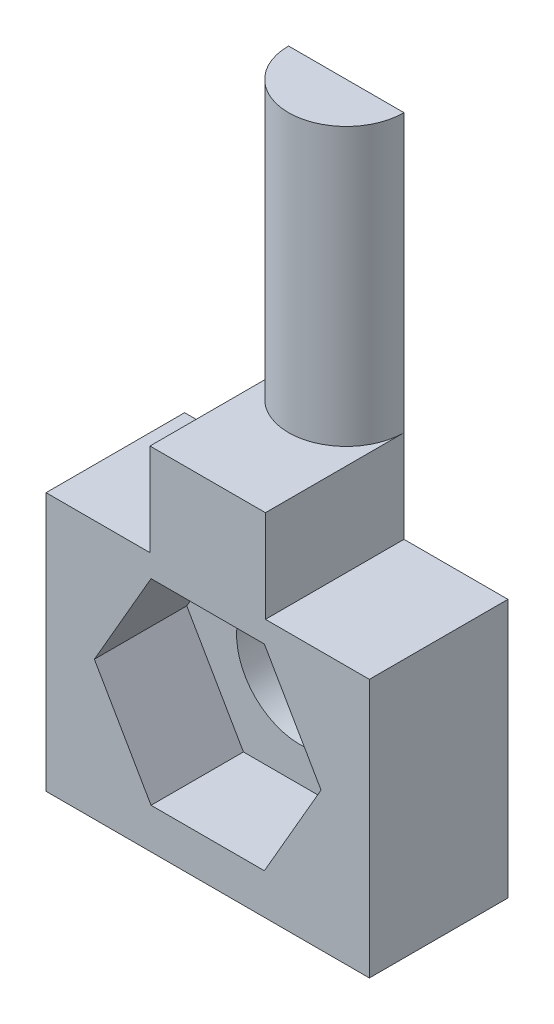
ISO-10303-21;
HEADER;
FILE_DESCRIPTION(('STEP AP214'),'2;1');
FILE_NAME('part.step','',(''),(''),'','','');
FILE_SCHEMA(('AUTOMOTIVE_DESIGN { 1 0 10303 214 1 1 1 1 }'));
ENDSEC;
DATA;
#1=APPLICATION_CONTEXT('core data for automotive mechanical design processes');
#2=APPLICATION_PROTOCOL_DEFINITION('international standard','automotive_design',2000,#1);
#3=PRODUCT_CONTEXT('',#1,'mechanical');
#4=PRODUCT('Part','Part','',(#3));
#5=PRODUCT_RELATED_PRODUCT_CATEGORY('part','',(#4));
#6=PRODUCT_DEFINITION_FORMATION('','',#4);
#7=PRODUCT_DEFINITION_CONTEXT('part definition',#1,'design');
#8=PRODUCT_DEFINITION('design','',#6,#7);
#9=PRODUCT_DEFINITION_SHAPE('','',#8);
#10=(LENGTH_UNIT() NAMED_UNIT(*) SI_UNIT(.MILLI.,.METRE.));
#11=(NAMED_UNIT(*) PLANE_ANGLE_UNIT() SI_UNIT($,.RADIAN.));
#12=(NAMED_UNIT(*) SI_UNIT($,.STERADIAN.) SOLID_ANGLE_UNIT());
#13=UNCERTAINTY_MEASURE_WITH_UNIT(LENGTH_MEASURE(1.E-05),#10,'distance_accuracy_value','');
#14=(GEOMETRIC_REPRESENTATION_CONTEXT(3) GLOBAL_UNCERTAINTY_ASSIGNED_CONTEXT((#13)) GLOBAL_UNIT_ASSIGNED_CONTEXT((#10,
#11,#12)) REPRESENTATION_CONTEXT('',''));
#15=CARTESIAN_POINT('',(0.,0.,0.));
#16=DIRECTION('',(0.,0.,1.));
#17=DIRECTION('',(1.,0.,0.));
#18=AXIS2_PLACEMENT_3D('',#15,#16,#17);
#19=CARTESIAN_POINT('',(-7.,6.,6.));
#20=DIRECTION('',(0.,0.,-1.));
#21=DIRECTION('',(-1.,0.,0.));
#22=AXIS2_PLACEMENT_3D('',#19,#20,#21);
#23=CYLINDRICAL_SURFACE('',#22,2.75);
#24=CARTESIAN_POINT('',(-7.,6.,0.));
#25=DIRECTION('',(0.,0.,1.));
#26=DIRECTION('',(1.,0.,0.));
#27=AXIS2_PLACEMENT_3D('',#24,#25,#26);
#28=CIRCLE('',#27,2.75);
#29=CARTESIAN_POINT('',(-4.25,6.,0.));
#30=VERTEX_POINT('',#29);
#31=EDGE_CURVE('E144',#30,#30,#28,.T.);
#32=ORIENTED_EDGE('',*,*,#31,.F.);
#33=EDGE_LOOP('',(#32));
#34=FACE_BOUND('',#33,.T.);
#35=CARTESIAN_POINT('',(-7.,6.,2.));
#36=DIRECTION('',(0.,0.,1.));
#37=DIRECTION('',(1.,0.,0.));
#38=AXIS2_PLACEMENT_3D('',#35,#36,#37);
#39=CIRCLE('',#38,2.75);
#40=CARTESIAN_POINT('',(-4.25,6.,2.));
#41=VERTEX_POINT('',#40);
#42=EDGE_CURVE('E37',#41,#41,#39,.T.);
#43=ORIENTED_EDGE('',*,*,#42,.T.);
#44=EDGE_LOOP('',(#43));
#45=FACE_BOUND('',#44,.T.);
#46=ADVANCED_FACE('F33',(#34,#45),#23,.F.);
#47=CARTESIAN_POINT('',(0.,0.,6.));
#48=DIRECTION('',(0.,0.,1.));
#49=DIRECTION('',(1.,0.,0.));
#50=AXIS2_PLACEMENT_3D('',#47,#48,#49);
#51=PLANE('',#50);
#52=DIRECTION('',(0.5,0.866025403784438,0.));
#53=VECTOR('',#52,1.);
#54=CARTESIAN_POINT('',(-4.54626135594409,1.75,6.));
#55=LINE('',#54,#53);
#56=CARTESIAN_POINT('',(-4.54626135594409,1.75,6.));
#57=VERTEX_POINT('',#56);
#58=CARTESIAN_POINT('',(-2.09252271188818,6.,6.));
#59=VERTEX_POINT('',#58);
#60=EDGE_CURVE('E49',#57,#59,#55,.T.);
#61=ORIENTED_EDGE('',*,*,#60,.F.);
#62=DIRECTION('',(1.,0.,0.));
#63=VECTOR('',#62,1.);
#64=CARTESIAN_POINT('',(-9.45373864405591,1.75,6.));
#65=LINE('',#64,#63);
#66=CARTESIAN_POINT('',(-9.45373864405591,1.75,6.));
#67=VERTEX_POINT('',#66);
#68=EDGE_CURVE('E417',#67,#57,#65,.T.);
#69=ORIENTED_EDGE('',*,*,#68,.F.);
#70=DIRECTION('',(0.5,-0.866025403784439,0.));
#71=VECTOR('',#70,1.);
#72=CARTESIAN_POINT('',(-11.9074772881118,6.,6.));
#73=LINE('',#72,#71);
#74=CARTESIAN_POINT('',(-11.9074772881118,6.,6.));
#75=VERTEX_POINT('',#74);
#76=EDGE_CURVE('E422',#75,#67,#73,.T.);
#77=ORIENTED_EDGE('',*,*,#76,.F.);
#78=DIRECTION('',(-0.5,-0.866025403784439,0.));
#79=VECTOR('',#78,1.);
#80=CARTESIAN_POINT('',(-9.45373864405591,10.25,6.));
#81=LINE('',#80,#79);
#82=CARTESIAN_POINT('',(-9.45373864405591,10.25,6.));
#83=VERTEX_POINT('',#82);
#84=EDGE_CURVE('E440',#83,#75,#81,.T.);
#85=ORIENTED_EDGE('',*,*,#84,.F.);
#86=DIRECTION('',(-1.,0.,0.));
#87=VECTOR('',#86,1.);
#88=CARTESIAN_POINT('',(-4.54626135594409,10.25,6.));
#89=LINE('',#88,#87);
#90=CARTESIAN_POINT('',(-4.54626135594409,10.25,6.));
#91=VERTEX_POINT('',#90);
#92=EDGE_CURVE('E437',#91,#83,#89,.T.);
#93=ORIENTED_EDGE('',*,*,#92,.F.);
#94=DIRECTION('',(-0.5,0.866025403784439,0.));
#95=VECTOR('',#94,1.);
#96=CARTESIAN_POINT('',(-2.09252271188818,6.,6.));
#97=LINE('',#96,#95);
#98=EDGE_CURVE('E434',#59,#91,#97,.T.);
#99=ORIENTED_EDGE('',*,*,#98,.F.);
#100=EDGE_LOOP('',(#61,#69,#77,#85,#93,#99));
#101=FACE_BOUND('',#100,.T.);
#102=DIRECTION('',(0.,1.,0.));
#103=VECTOR('',#102,1.);
#104=CARTESIAN_POINT('',(0.,0.,6.));
#105=LINE('',#104,#103);
#106=CARTESIAN_POINT('',(0.,0.,6.));
#107=VERTEX_POINT('',#106);
#108=CARTESIAN_POINT('',(0.,11.2,6.));
#109=VERTEX_POINT('',#108);
#110=EDGE_CURVE('E155',#107,#109,#105,.T.);
#111=ORIENTED_EDGE('',*,*,#110,.T.);
#112=DIRECTION('',(-1.,0.,0.));
#113=VECTOR('',#112,1.);
#114=CARTESIAN_POINT('',(0.,11.2,6.));
#115=LINE('',#114,#113);
#116=CARTESIAN_POINT('',(-4.5,11.2,6.));
#117=VERTEX_POINT('',#116);
#118=EDGE_CURVE('E96',#109,#117,#115,.T.);
#119=ORIENTED_EDGE('',*,*,#118,.T.);
#120=DIRECTION('',(0.,1.,0.));
#121=VECTOR('',#120,1.);
#122=CARTESIAN_POINT('',(-4.5,11.2,6.));
#123=LINE('',#122,#121);
#124=CARTESIAN_POINT('',(-4.5,15.2,6.));
#125=VERTEX_POINT('',#124);
#126=EDGE_CURVE('E172',#117,#125,#123,.T.);
#127=ORIENTED_EDGE('',*,*,#126,.T.);
#128=DIRECTION('',(-1.,0.,0.));
#129=VECTOR('',#128,1.);
#130=CARTESIAN_POINT('',(-9.5,15.2,6.));
#131=LINE('',#130,#129);
#132=CARTESIAN_POINT('',(-9.5,15.2,6.));
#133=VERTEX_POINT('',#132);
#134=EDGE_CURVE('E209',#125,#133,#131,.T.);
#135=ORIENTED_EDGE('',*,*,#134,.T.);
#136=DIRECTION('',(0.,-1.,0.));
#137=VECTOR('',#136,1.);
#138=CARTESIAN_POINT('',(-9.5,11.2,6.));
#139=LINE('',#138,#137);
#140=CARTESIAN_POINT('',(-9.5,11.2,6.));
#141=VERTEX_POINT('',#140);
#142=EDGE_CURVE('E119',#133,#141,#139,.T.);
#143=ORIENTED_EDGE('',*,*,#142,.T.);
#144=DIRECTION('',(-1.,0.,0.));
#145=VECTOR('',#144,1.);
#146=CARTESIAN_POINT('',(-9.5,11.2,6.));
#147=LINE('',#146,#145);
#148=CARTESIAN_POINT('',(-14.,11.2,6.));
#149=VERTEX_POINT('',#148);
#150=EDGE_CURVE('E112',#141,#149,#147,.T.);
#151=ORIENTED_EDGE('',*,*,#150,.T.);
#152=DIRECTION('',(0.,-1.,0.));
#153=VECTOR('',#152,1.);
#154=CARTESIAN_POINT('',(-14.,0.,6.));
#155=LINE('',#154,#153);
#156=CARTESIAN_POINT('',(-14.,0.,6.));
#157=VERTEX_POINT('',#156);
#158=EDGE_CURVE('E116',#149,#157,#155,.T.);
#159=ORIENTED_EDGE('',*,*,#158,.T.);
#160=DIRECTION('',(1.,0.,0.));
#161=VECTOR('',#160,1.);
#162=CARTESIAN_POINT('',(0.,0.,6.));
#163=LINE('',#162,#161);
#164=EDGE_CURVE('E58',#157,#107,#163,.T.);
#165=ORIENTED_EDGE('',*,*,#164,.T.);
#166=EDGE_LOOP('',(#111,#119,#127,#135,#143,#151,#159,#165));
#167=FACE_BOUND('',#166,.T.);
#168=ADVANCED_FACE('F114',(#101,#167),#51,.T.);
#169=CARTESIAN_POINT('',(0.,0.,0.));
#170=DIRECTION('',(0.,0.,1.));
#171=DIRECTION('',(1.,0.,0.));
#172=AXIS2_PLACEMENT_3D('',#169,#170,#171);
#173=PLANE('',#172);
#174=DIRECTION('',(0.,1.,0.));
#175=VECTOR('',#174,1.);
#176=CARTESIAN_POINT('',(0.,0.,0.));
#177=LINE('',#176,#175);
#178=CARTESIAN_POINT('',(0.,0.,0.));
#179=VERTEX_POINT('',#178);
#180=CARTESIAN_POINT('',(0.,11.2,0.));
#181=VERTEX_POINT('',#180);
#182=EDGE_CURVE('E140',#179,#181,#177,.T.);
#183=ORIENTED_EDGE('',*,*,#182,.F.);
#184=DIRECTION('',(1.,0.,0.));
#185=VECTOR('',#184,1.);
#186=CARTESIAN_POINT('',(0.,0.,0.));
#187=LINE('',#186,#185);
#188=CARTESIAN_POINT('',(-14.,0.,0.));
#189=VERTEX_POINT('',#188);
#190=EDGE_CURVE('E88',#189,#179,#187,.T.);
#191=ORIENTED_EDGE('',*,*,#190,.F.);
#192=DIRECTION('',(0.,-1.,0.));
#193=VECTOR('',#192,1.);
#194=CARTESIAN_POINT('',(-14.,0.,0.));
#195=LINE('',#194,#193);
#196=CARTESIAN_POINT('',(-14.,11.2,0.));
#197=VERTEX_POINT('',#196);
#198=EDGE_CURVE('E152',#197,#189,#195,.T.);
#199=ORIENTED_EDGE('',*,*,#198,.F.);
#200=DIRECTION('',(-1.,0.,0.));
#201=VECTOR('',#200,1.);
#202=CARTESIAN_POINT('',(-9.5,11.2,0.));
#203=LINE('',#202,#201);
#204=CARTESIAN_POINT('',(-9.5,11.2,0.));
#205=VERTEX_POINT('',#204);
#206=EDGE_CURVE('E128',#205,#197,#203,.T.);
#207=ORIENTED_EDGE('',*,*,#206,.F.);
#208=DIRECTION('',(0.,-1.,0.));
#209=VECTOR('',#208,1.);
#210=CARTESIAN_POINT('',(-9.5,11.2,0.));
#211=LINE('',#210,#209);
#212=CARTESIAN_POINT('',(-9.5,15.2,0.));
#213=VERTEX_POINT('',#212);
#214=EDGE_CURVE('E149',#213,#205,#211,.T.);
#215=ORIENTED_EDGE('',*,*,#214,.F.);
#216=DIRECTION('',(0.,-1.,0.));
#217=VECTOR('',#216,1.);
#218=CARTESIAN_POINT('',(-9.5,27.2,0.));
#219=LINE('',#218,#217);
#220=CARTESIAN_POINT('',(-9.5,27.2,0.));
#221=VERTEX_POINT('',#220);
#222=EDGE_CURVE('E189',#221,#213,#219,.T.);
#223=ORIENTED_EDGE('',*,*,#222,.F.);
#224=DIRECTION('',(-1.,0.,0.));
#225=VECTOR('',#224,1.);
#226=CARTESIAN_POINT('',(-9.5,27.2,0.));
#227=LINE('',#226,#225);
#228=CARTESIAN_POINT('',(-4.5,27.2,0.));
#229=VERTEX_POINT('',#228);
#230=EDGE_CURVE('E184',#229,#221,#227,.T.);
#231=ORIENTED_EDGE('',*,*,#230,.F.);
#232=DIRECTION('',(0.,-1.,0.));
#233=VECTOR('',#232,1.);
#234=CARTESIAN_POINT('',(-4.5,27.2,0.));
#235=LINE('',#234,#233);
#236=CARTESIAN_POINT('',(-4.5,15.2,0.));
#237=VERTEX_POINT('',#236);
#238=EDGE_CURVE('E179',#229,#237,#235,.T.);
#239=ORIENTED_EDGE('',*,*,#238,.T.);
#240=DIRECTION('',(0.,1.,0.));
#241=VECTOR('',#240,1.);
#242=CARTESIAN_POINT('',(-4.5,11.2,0.));
#243=LINE('',#242,#241);
#244=CARTESIAN_POINT('',(-4.5,11.2,0.));
#245=VERTEX_POINT('',#244);
#246=EDGE_CURVE('E146',#245,#237,#243,.T.);
#247=ORIENTED_EDGE('',*,*,#246,.F.);
#248=DIRECTION('',(-1.,0.,0.));
#249=VECTOR('',#248,1.);
#250=CARTESIAN_POINT('',(0.,11.2,0.));
#251=LINE('',#250,#249);
#252=EDGE_CURVE('E143',#181,#245,#251,.T.);
#253=ORIENTED_EDGE('',*,*,#252,.F.);
#254=EDGE_LOOP('',(#183,#191,#199,#207,#215,#223,#231,#239,#247,#253));
#255=FACE_BOUND('',#254,.T.);
#256=ORIENTED_EDGE('',*,*,#31,.T.);
#257=EDGE_LOOP('',(#256));
#258=FACE_BOUND('',#257,.T.);
#259=ADVANCED_FACE('F175',(#255,#258),#173,.F.);
#260=CARTESIAN_POINT('',(0.,0.,6.));
#261=DIRECTION('',(-1.,0.,0.));
#262=DIRECTION('',(0.,-1.,0.));
#263=AXIS2_PLACEMENT_3D('',#260,#261,#262);
#264=PLANE('',#263);
#265=ORIENTED_EDGE('',*,*,#182,.T.);
#266=DIRECTION('',(0.,0.,-1.));
#267=VECTOR('',#266,1.);
#268=CARTESIAN_POINT('',(0.,11.2,6.));
#269=LINE('',#268,#267);
#270=EDGE_CURVE('E11',#109,#181,#269,.T.);
#271=ORIENTED_EDGE('',*,*,#270,.F.);
#272=ORIENTED_EDGE('',*,*,#110,.F.);
#273=DIRECTION('',(0.,0.,-1.));
#274=VECTOR('',#273,1.);
#275=CARTESIAN_POINT('',(0.,0.,6.));
#276=LINE('',#275,#274);
#277=EDGE_CURVE('E136',#107,#179,#276,.T.);
#278=ORIENTED_EDGE('',*,*,#277,.T.);
#279=EDGE_LOOP('',(#265,#271,#272,#278));
#280=FACE_BOUND('',#279,.T.);
#281=ADVANCED_FACE('F35',(#280),#264,.F.);
#282=CARTESIAN_POINT('',(0.,11.2,6.));
#283=DIRECTION('',(0.,-1.,0.));
#284=DIRECTION('',(1.,0.,0.));
#285=AXIS2_PLACEMENT_3D('',#282,#283,#284);
#286=PLANE('',#285);
#287=ORIENTED_EDGE('',*,*,#252,.T.);
#288=DIRECTION('',(0.,0.,-1.));
#289=VECTOR('',#288,1.);
#290=CARTESIAN_POINT('',(-4.5,11.2,6.));
#291=LINE('',#290,#289);
#292=EDGE_CURVE('E42',#117,#245,#291,.T.);
#293=ORIENTED_EDGE('',*,*,#292,.F.);
#294=ORIENTED_EDGE('',*,*,#118,.F.);
#295=ORIENTED_EDGE('',*,*,#270,.T.);
#296=EDGE_LOOP('',(#287,#293,#294,#295));
#297=FACE_BOUND('',#296,.T.);
#298=ADVANCED_FACE('F219',(#297),#286,.F.);
#299=CARTESIAN_POINT('',(-4.5,11.2,6.));
#300=DIRECTION('',(-1.,0.,0.));
#301=DIRECTION('',(0.,0.,1.));
#302=AXIS2_PLACEMENT_3D('',#299,#300,#301);
#303=PLANE('',#302);
#304=ORIENTED_EDGE('',*,*,#246,.T.);
#305=DIRECTION('',(0.,0.,-1.));
#306=VECTOR('',#305,1.);
#307=CARTESIAN_POINT('',(-4.5,15.2,6.));
#308=LINE('',#307,#306);
#309=EDGE_CURVE('E162',#125,#237,#308,.T.);
#310=ORIENTED_EDGE('',*,*,#309,.F.);
#311=ORIENTED_EDGE('',*,*,#126,.F.);
#312=ORIENTED_EDGE('',*,*,#292,.T.);
#313=EDGE_LOOP('',(#304,#310,#311,#312));
#314=FACE_BOUND('',#313,.T.);
#315=ADVANCED_FACE('F169',(#314),#303,.F.);
#316=CARTESIAN_POINT('',(-9.5,15.2,6.));
#317=DIRECTION('',(0.,-1.,0.));
#318=DIRECTION('',(0.,0.,-1.));
#319=AXIS2_PLACEMENT_3D('',#316,#317,#318);
#320=PLANE('',#319);
#321=CARTESIAN_POINT('',(-7.,15.2,0.));
#322=DIRECTION('',(0.,1.,0.));
#323=DIRECTION('',(0.,0.,1.));
#324=AXIS2_PLACEMENT_3D('',#321,#322,#323);
#325=CIRCLE('',#324,2.5);
#326=EDGE_CURVE('E192',#213,#237,#325,.T.);
#327=ORIENTED_EDGE('',*,*,#326,.F.);
#328=DIRECTION('',(0.,0.,-1.));
#329=VECTOR('',#328,1.);
#330=CARTESIAN_POINT('',(-9.5,15.2,6.));
#331=LINE('',#330,#329);
#332=EDGE_CURVE('E159',#133,#213,#331,.T.);
#333=ORIENTED_EDGE('',*,*,#332,.F.);
#334=ORIENTED_EDGE('',*,*,#134,.F.);
#335=ORIENTED_EDGE('',*,*,#309,.T.);
#336=EDGE_LOOP('',(#327,#333,#334,#335));
#337=FACE_BOUND('',#336,.T.);
#338=ADVANCED_FACE('F211',(#337),#320,.F.);
#339=CARTESIAN_POINT('',(-9.5,11.2,6.));
#340=DIRECTION('',(1.,0.,0.));
#341=DIRECTION('',(0.,0.,-1.));
#342=AXIS2_PLACEMENT_3D('',#339,#340,#341);
#343=PLANE('',#342);
#344=ORIENTED_EDGE('',*,*,#214,.T.);
#345=DIRECTION('',(0.,0.,-1.));
#346=VECTOR('',#345,1.);
#347=CARTESIAN_POINT('',(-9.5,11.2,6.));
#348=LINE('',#347,#346);
#349=EDGE_CURVE('E131',#141,#205,#348,.T.);
#350=ORIENTED_EDGE('',*,*,#349,.F.);
#351=ORIENTED_EDGE('',*,*,#142,.F.);
#352=ORIENTED_EDGE('',*,*,#332,.T.);
#353=EDGE_LOOP('',(#344,#350,#351,#352));
#354=FACE_BOUND('',#353,.T.);
#355=ADVANCED_FACE('F214',(#354),#343,.F.);
#356=CARTESIAN_POINT('',(-9.5,11.2,6.));
#357=DIRECTION('',(0.,-1.,0.));
#358=DIRECTION('',(0.,0.,-1.));
#359=AXIS2_PLACEMENT_3D('',#356,#357,#358);
#360=PLANE('',#359);
#361=ORIENTED_EDGE('',*,*,#206,.T.);
#362=DIRECTION('',(0.,0.,-1.));
#363=VECTOR('',#362,1.);
#364=CARTESIAN_POINT('',(-14.,11.2,6.));
#365=LINE('',#364,#363);
#366=EDGE_CURVE('E125',#149,#197,#365,.T.);
#367=ORIENTED_EDGE('',*,*,#366,.F.);
#368=ORIENTED_EDGE('',*,*,#150,.F.);
#369=ORIENTED_EDGE('',*,*,#349,.T.);
#370=EDGE_LOOP('',(#361,#367,#368,#369));
#371=FACE_BOUND('',#370,.T.);
#372=ADVANCED_FACE('F126',(#371),#360,.F.);
#373=CARTESIAN_POINT('',(-14.,0.,6.));
#374=DIRECTION('',(1.,0.,0.));
#375=DIRECTION('',(0.,0.,-1.));
#376=AXIS2_PLACEMENT_3D('',#373,#374,#375);
#377=PLANE('',#376);
#378=ORIENTED_EDGE('',*,*,#198,.T.);
#379=DIRECTION('',(0.,0.,-1.));
#380=VECTOR('',#379,1.);
#381=CARTESIAN_POINT('',(-14.,0.,6.));
#382=LINE('',#381,#380);
#383=EDGE_CURVE('E132',#157,#189,#382,.T.);
#384=ORIENTED_EDGE('',*,*,#383,.F.);
#385=ORIENTED_EDGE('',*,*,#158,.F.);
#386=ORIENTED_EDGE('',*,*,#366,.T.);
#387=EDGE_LOOP('',(#378,#384,#385,#386));
#388=FACE_BOUND('',#387,.T.);
#389=ADVANCED_FACE('F134',(#388),#377,.F.);
#390=CARTESIAN_POINT('',(0.,0.,6.));
#391=DIRECTION('',(0.,1.,0.));
#392=DIRECTION('',(0.,0.,1.));
#393=AXIS2_PLACEMENT_3D('',#390,#391,#392);
#394=PLANE('',#393);
#395=ORIENTED_EDGE('',*,*,#190,.T.);
#396=ORIENTED_EDGE('',*,*,#277,.F.);
#397=ORIENTED_EDGE('',*,*,#164,.F.);
#398=ORIENTED_EDGE('',*,*,#383,.T.);
#399=EDGE_LOOP('',(#395,#396,#397,#398));
#400=FACE_BOUND('',#399,.T.);
#401=ADVANCED_FACE('F215',(#400),#394,.F.);
#402=CARTESIAN_POINT('',(-7.,27.2,0.));
#403=DIRECTION('',(0.,-1.,0.));
#404=DIRECTION('',(0.,0.,-1.));
#405=AXIS2_PLACEMENT_3D('',#402,#403,#404);
#406=CYLINDRICAL_SURFACE('',#405,2.5);
#407=ORIENTED_EDGE('',*,*,#326,.T.);
#408=ORIENTED_EDGE('',*,*,#238,.F.);
#409=CARTESIAN_POINT('',(-7.,27.2,0.));
#410=DIRECTION('',(0.,1.,0.));
#411=DIRECTION('',(0.,0.,1.));
#412=AXIS2_PLACEMENT_3D('',#409,#410,#411);
#413=CIRCLE('',#412,2.5);
#414=EDGE_CURVE('E196',#221,#229,#413,.T.);
#415=ORIENTED_EDGE('',*,*,#414,.F.);
#416=ORIENTED_EDGE('',*,*,#222,.T.);
#417=EDGE_LOOP('',(#407,#408,#415,#416));
#418=FACE_BOUND('',#417,.T.);
#419=ADVANCED_FACE('F193',(#418),#406,.T.);
#420=CARTESIAN_POINT('',(-7.,27.2,0.));
#421=DIRECTION('',(0.,1.,0.));
#422=DIRECTION('',(0.,0.,1.));
#423=AXIS2_PLACEMENT_3D('',#420,#421,#422);
#424=PLANE('',#423);
#425=ORIENTED_EDGE('',*,*,#414,.T.);
#426=ORIENTED_EDGE('',*,*,#230,.T.);
#427=EDGE_LOOP('',(#425,#426));
#428=FACE_BOUND('',#427,.T.);
#429=ADVANCED_FACE('F277',(#428),#424,.T.);
#430=CARTESIAN_POINT('',(-4.54626135594409,1.75,2.));
#431=DIRECTION('',(0.866025403784439,-0.5,0.));
#432=DIRECTION('',(0.5,0.866025403784439,0.));
#433=AXIS2_PLACEMENT_3D('',#430,#431,#432);
#434=PLANE('',#433);
#435=ORIENTED_EDGE('',*,*,#60,.T.);
#436=DIRECTION('',(0.,0.,1.));
#437=VECTOR('',#436,1.);
#438=CARTESIAN_POINT('',(-2.09252271188818,6.,2.));
#439=LINE('',#438,#437);
#440=CARTESIAN_POINT('',(-2.09252271188818,6.,2.));
#441=VERTEX_POINT('',#440);
#442=EDGE_CURVE('E432',#441,#59,#439,.T.);
#443=ORIENTED_EDGE('',*,*,#442,.F.);
#444=DIRECTION('',(0.5,0.866025403784438,0.));
#445=VECTOR('',#444,1.);
#446=CARTESIAN_POINT('',(-4.54626135594409,1.75,2.));
#447=LINE('',#446,#445);
#448=CARTESIAN_POINT('',(-4.54626135594409,1.75,2.));
#449=VERTEX_POINT('',#448);
#450=EDGE_CURVE('E407',#449,#441,#447,.T.);
#451=ORIENTED_EDGE('',*,*,#450,.F.);
#452=DIRECTION('',(0.,0.,1.));
#453=VECTOR('',#452,1.);
#454=CARTESIAN_POINT('',(-4.54626135594409,1.75,2.));
#455=LINE('',#454,#453);
#456=EDGE_CURVE('E200',#449,#57,#455,.T.);
#457=ORIENTED_EDGE('',*,*,#456,.T.);
#458=EDGE_LOOP('',(#435,#443,#451,#457));
#459=FACE_BOUND('',#458,.T.);
#460=ADVANCED_FACE('F283',(#459),#434,.F.);
#461=CARTESIAN_POINT('',(-9.45373864405591,1.75,2.));
#462=DIRECTION('',(0.,-1.,0.));
#463=DIRECTION('',(1.,0.,0.));
#464=AXIS2_PLACEMENT_3D('',#461,#462,#463);
#465=PLANE('',#464);
#466=ORIENTED_EDGE('',*,*,#68,.T.);
#467=ORIENTED_EDGE('',*,*,#456,.F.);
#468=DIRECTION('',(1.,0.,0.));
#469=VECTOR('',#468,1.);
#470=CARTESIAN_POINT('',(-9.45373864405591,1.75,2.));
#471=LINE('',#470,#469);
#472=CARTESIAN_POINT('',(-9.45373864405591,1.75,2.));
#473=VERTEX_POINT('',#472);
#474=EDGE_CURVE('E414',#473,#449,#471,.T.);
#475=ORIENTED_EDGE('',*,*,#474,.F.);
#476=DIRECTION('',(0.,0.,1.));
#477=VECTOR('',#476,1.);
#478=CARTESIAN_POINT('',(-9.45373864405591,1.75,2.));
#479=LINE('',#478,#477);
#480=EDGE_CURVE('E446',#473,#67,#479,.T.);
#481=ORIENTED_EDGE('',*,*,#480,.T.);
#482=EDGE_LOOP('',(#466,#467,#475,#481));
#483=FACE_BOUND('',#482,.T.);
#484=ADVANCED_FACE('F290',(#483),#465,.F.);
#485=CARTESIAN_POINT('',(-11.9074772881118,6.,2.));
#486=DIRECTION('',(-0.866025403784439,-0.5,0.));
#487=DIRECTION('',(0.5,-0.866025403784439,0.));
#488=AXIS2_PLACEMENT_3D('',#485,#486,#487);
#489=PLANE('',#488);
#490=ORIENTED_EDGE('',*,*,#76,.T.);
#491=ORIENTED_EDGE('',*,*,#480,.F.);
#492=DIRECTION('',(0.5,-0.866025403784439,0.));
#493=VECTOR('',#492,1.);
#494=CARTESIAN_POINT('',(-11.9074772881118,6.,2.));
#495=LINE('',#494,#493);
#496=CARTESIAN_POINT('',(-11.9074772881118,6.,2.));
#497=VERTEX_POINT('',#496);
#498=EDGE_CURVE('E429',#497,#473,#495,.T.);
#499=ORIENTED_EDGE('',*,*,#498,.F.);
#500=DIRECTION('',(0.,0.,1.));
#501=VECTOR('',#500,1.);
#502=CARTESIAN_POINT('',(-11.9074772881118,6.,2.));
#503=LINE('',#502,#501);
#504=EDGE_CURVE('E449',#497,#75,#503,.T.);
#505=ORIENTED_EDGE('',*,*,#504,.T.);
#506=EDGE_LOOP('',(#490,#491,#499,#505));
#507=FACE_BOUND('',#506,.T.);
#508=ADVANCED_FACE('F298',(#507),#489,.F.);
#509=CARTESIAN_POINT('',(-9.45373864405591,10.25,2.));
#510=DIRECTION('',(-0.866025403784439,0.5,0.));
#511=DIRECTION('',(-0.5,-0.866025403784439,0.));
#512=AXIS2_PLACEMENT_3D('',#509,#510,#511);
#513=PLANE('',#512);
#514=ORIENTED_EDGE('',*,*,#84,.T.);
#515=ORIENTED_EDGE('',*,*,#504,.F.);
#516=DIRECTION('',(-0.5,-0.866025403784439,0.));
#517=VECTOR('',#516,1.);
#518=CARTESIAN_POINT('',(-9.45373864405591,10.25,2.));
#519=LINE('',#518,#517);
#520=CARTESIAN_POINT('',(-9.45373864405591,10.25,2.));
#521=VERTEX_POINT('',#520);
#522=EDGE_CURVE('E426',#521,#497,#519,.T.);
#523=ORIENTED_EDGE('',*,*,#522,.F.);
#524=DIRECTION('',(0.,0.,1.));
#525=VECTOR('',#524,1.);
#526=CARTESIAN_POINT('',(-9.45373864405591,10.25,2.));
#527=LINE('',#526,#525);
#528=EDGE_CURVE('E452',#521,#83,#527,.T.);
#529=ORIENTED_EDGE('',*,*,#528,.T.);
#530=EDGE_LOOP('',(#514,#515,#523,#529));
#531=FACE_BOUND('',#530,.T.);
#532=ADVANCED_FACE('F306',(#531),#513,.F.);
#533=CARTESIAN_POINT('',(-4.54626135594409,10.25,2.));
#534=DIRECTION('',(0.,1.,0.));
#535=DIRECTION('',(0.,0.,1.));
#536=AXIS2_PLACEMENT_3D('',#533,#534,#535);
#537=PLANE('',#536);
#538=ORIENTED_EDGE('',*,*,#92,.T.);
#539=ORIENTED_EDGE('',*,*,#528,.F.);
#540=DIRECTION('',(-1.,0.,0.));
#541=VECTOR('',#540,1.);
#542=CARTESIAN_POINT('',(-4.54626135594409,10.25,2.));
#543=LINE('',#542,#541);
#544=CARTESIAN_POINT('',(-4.54626135594409,10.25,2.));
#545=VERTEX_POINT('',#544);
#546=EDGE_CURVE('E419',#545,#521,#543,.T.);
#547=ORIENTED_EDGE('',*,*,#546,.F.);
#548=DIRECTION('',(0.,0.,1.));
#549=VECTOR('',#548,1.);
#550=CARTESIAN_POINT('',(-4.54626135594409,10.25,2.));
#551=LINE('',#550,#549);
#552=EDGE_CURVE('E455',#545,#91,#551,.T.);
#553=ORIENTED_EDGE('',*,*,#552,.T.);
#554=EDGE_LOOP('',(#538,#539,#547,#553));
#555=FACE_BOUND('',#554,.T.);
#556=ADVANCED_FACE('F314',(#555),#537,.F.);
#557=CARTESIAN_POINT('',(-2.09252271188818,6.,2.));
#558=DIRECTION('',(0.866025403784439,0.5,0.));
#559=DIRECTION('',(-0.5,0.866025403784439,0.));
#560=AXIS2_PLACEMENT_3D('',#557,#558,#559);
#561=PLANE('',#560);
#562=ORIENTED_EDGE('',*,*,#98,.T.);
#563=ORIENTED_EDGE('',*,*,#552,.F.);
#564=DIRECTION('',(-0.5,0.866025403784439,0.));
#565=VECTOR('',#564,1.);
#566=CARTESIAN_POINT('',(-2.09252271188818,6.,2.));
#567=LINE('',#566,#565);
#568=EDGE_CURVE('E411',#441,#545,#567,.T.);
#569=ORIENTED_EDGE('',*,*,#568,.F.);
#570=ORIENTED_EDGE('',*,*,#442,.T.);
#571=EDGE_LOOP('',(#562,#563,#569,#570));
#572=FACE_BOUND('',#571,.T.);
#573=ADVANCED_FACE('F322',(#572),#561,.F.);
#574=CARTESIAN_POINT('',(0.,0.,2.));
#575=DIRECTION('',(0.,0.,1.));
#576=DIRECTION('',(1.,0.,0.));
#577=AXIS2_PLACEMENT_3D('',#574,#575,#576);
#578=PLANE('',#577);
#579=ORIENTED_EDGE('',*,*,#42,.F.);
#580=EDGE_LOOP('',(#579));
#581=FACE_BOUND('',#580,.T.);
#582=ORIENTED_EDGE('',*,*,#450,.T.);
#583=ORIENTED_EDGE('',*,*,#568,.T.);
#584=ORIENTED_EDGE('',*,*,#546,.T.);
#585=ORIENTED_EDGE('',*,*,#522,.T.);
#586=ORIENTED_EDGE('',*,*,#498,.T.);
#587=ORIENTED_EDGE('',*,*,#474,.T.);
#588=EDGE_LOOP('',(#582,#583,#584,#585,#586,#587));
#589=FACE_BOUND('',#588,.T.);
#590=ADVANCED_FACE('F330',(#581,#589),#578,.T.);
#591=CLOSED_SHELL('',(#46,#168,#259,#281,#298,#315,#338,#355,#372,#389,#401,#419,#429,#460,#484,
#508,#532,#556,#573,#590));
#592=MANIFOLD_SOLID_BREP('B2',#591);
#593=ADVANCED_BREP_SHAPE_REPRESENTATION('',(#18,#592),#14);
#594=SHAPE_DEFINITION_REPRESENTATION(#9,#593);
ENDSEC;
END-ISO-10303-21;
